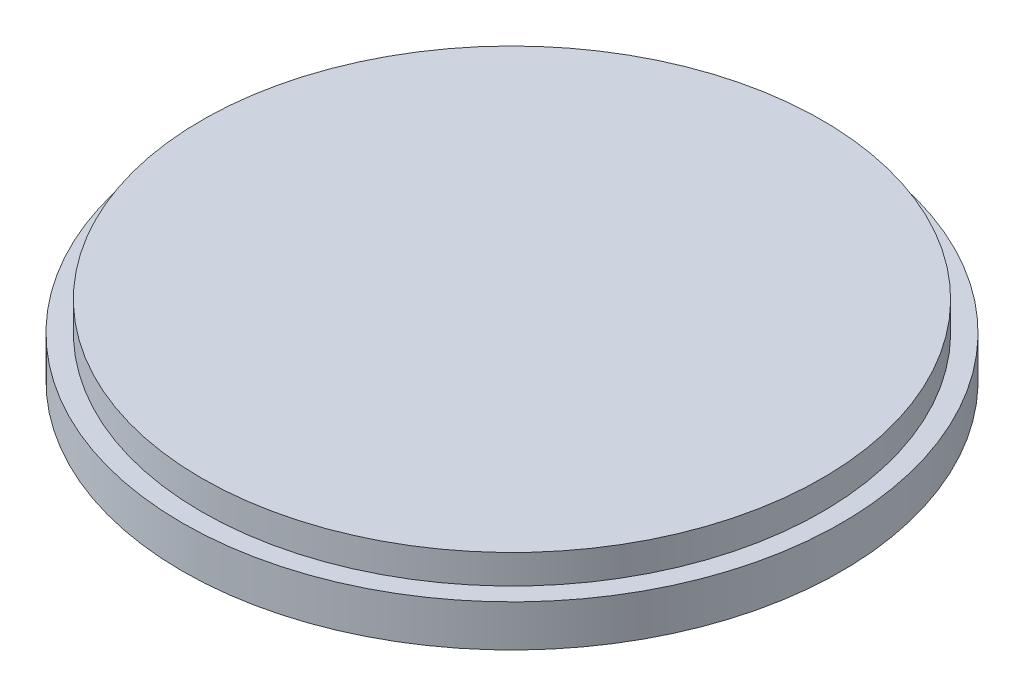
ISO-10303-21;
HEADER;
FILE_DESCRIPTION(('STEP AP214'),'2;1');
FILE_NAME('part.step','',(''),(''),'','','');
FILE_SCHEMA(('AUTOMOTIVE_DESIGN { 1 0 10303 214 1 1 1 1 }'));
ENDSEC;
DATA;
#1=APPLICATION_CONTEXT('core data for automotive mechanical design processes');
#2=APPLICATION_PROTOCOL_DEFINITION('international standard','automotive_design',2000,#1);
#3=PRODUCT_CONTEXT('',#1,'mechanical');
#4=PRODUCT('Part','Part','',(#3));
#5=PRODUCT_RELATED_PRODUCT_CATEGORY('part','',(#4));
#6=PRODUCT_DEFINITION_FORMATION('','',#4);
#7=PRODUCT_DEFINITION_CONTEXT('part definition',#1,'design');
#8=PRODUCT_DEFINITION('design','',#6,#7);
#9=PRODUCT_DEFINITION_SHAPE('','',#8);
#10=(LENGTH_UNIT() NAMED_UNIT(*) SI_UNIT(.MILLI.,.METRE.));
#11=(NAMED_UNIT(*) PLANE_ANGLE_UNIT() SI_UNIT($,.RADIAN.));
#12=(NAMED_UNIT(*) SI_UNIT($,.STERADIAN.) SOLID_ANGLE_UNIT());
#13=UNCERTAINTY_MEASURE_WITH_UNIT(LENGTH_MEASURE(1.E-05),#10,'distance_accuracy_value','');
#14=(GEOMETRIC_REPRESENTATION_CONTEXT(3) GLOBAL_UNCERTAINTY_ASSIGNED_CONTEXT((#13)) GLOBAL_UNIT_ASSIGNED_CONTEXT((#10,
#11,#12)) REPRESENTATION_CONTEXT('',''));
#15=CARTESIAN_POINT('',(0.,0.,0.));
#16=DIRECTION('',(0.,0.,1.));
#17=DIRECTION('',(1.,0.,0.));
#18=AXIS2_PLACEMENT_3D('',#15,#16,#17);
#19=CARTESIAN_POINT('',(0.,-7.3,0.));
#20=DIRECTION('',(0.,-1.,0.));
#21=DIRECTION('',(0.,0.,-1.));
#22=AXIS2_PLACEMENT_3D('',#19,#20,#21);
#23=CYLINDRICAL_SURFACE('',#22,34.);
#24=CARTESIAN_POINT('',(0.,-4.3,0.));
#25=DIRECTION('',(0.,-1.,0.));
#26=DIRECTION('',(0.,0.,-1.));
#27=AXIS2_PLACEMENT_3D('',#24,#25,#26);
#28=CIRCLE('',#27,34.);
#29=CARTESIAN_POINT('',(0.,-4.3,-34.));
#30=VERTEX_POINT('',#29);
#31=EDGE_CURVE('E88',#30,#30,#28,.T.);
#32=ORIENTED_EDGE('',*,*,#31,.F.);
#33=EDGE_LOOP('',(#32));
#34=FACE_BOUND('',#33,.T.);
#35=CARTESIAN_POINT('',(0.,0.,0.));
#36=DIRECTION('',(0.,-1.,0.));
#37=DIRECTION('',(0.,0.,-1.));
#38=AXIS2_PLACEMENT_3D('',#35,#36,#37);
#39=CIRCLE('',#38,34.);
#40=CARTESIAN_POINT('',(0.,0.,-34.));
#41=VERTEX_POINT('',#40);
#42=EDGE_CURVE('E35',#41,#41,#39,.T.);
#43=ORIENTED_EDGE('',*,*,#42,.T.);
#44=EDGE_LOOP('',(#43));
#45=FACE_BOUND('',#44,.T.);
#46=ADVANCED_FACE('F32',(#34,#45),#23,.T.);
#47=CARTESIAN_POINT('',(-34.,0.,0.));
#48=DIRECTION('',(0.,-1.,0.));
#49=DIRECTION('',(0.,0.,-1.));
#50=AXIS2_PLACEMENT_3D('',#47,#48,#49);
#51=PLANE('',#50);
#52=CARTESIAN_POINT('',(0.,0.,0.));
#53=DIRECTION('',(0.,1.,0.));
#54=DIRECTION('',(0.,0.,1.));
#55=AXIS2_PLACEMENT_3D('',#52,#53,#54);
#56=CIRCLE('',#55,32.);
#57=CARTESIAN_POINT('',(0.,0.,32.));
#58=VERTEX_POINT('',#57);
#59=EDGE_CURVE('E11',#58,#58,#56,.T.);
#60=ORIENTED_EDGE('',*,*,#59,.F.);
#61=EDGE_LOOP('',(#60));
#62=FACE_BOUND('',#61,.T.);
#63=ORIENTED_EDGE('',*,*,#42,.F.);
#64=EDGE_LOOP('',(#63));
#65=FACE_BOUND('',#64,.T.);
#66=ADVANCED_FACE('F99',(#62,#65),#51,.F.);
#67=CARTESIAN_POINT('',(-26.5,-7.3,0.));
#68=DIRECTION('',(0.,1.,0.));
#69=DIRECTION('',(0.,0.,1.));
#70=AXIS2_PLACEMENT_3D('',#67,#68,#69);
#71=PLANE('',#70);
#72=CARTESIAN_POINT('',(-15.5563491861041,-7.3,15.556349186104));
#73=DIRECTION('',(0.,-1.,0.));
#74=DIRECTION('',(0.,0.,-1.));
#75=AXIS2_PLACEMENT_3D('',#72,#73,#74);
#76=CIRCLE('',#75,1.69999999999999);
#77=CARTESIAN_POINT('',(-15.5563491861041,-7.3,13.856349186104));
#78=VERTEX_POINT('',#77);
#79=EDGE_CURVE('E64',#78,#78,#76,.T.);
#80=ORIENTED_EDGE('',*,*,#79,.F.);
#81=EDGE_LOOP('',(#80));
#82=FACE_BOUND('',#81,.T.);
#83=CARTESIAN_POINT('',(-15.556349186104,-7.3,-15.5563491861041));
#84=DIRECTION('',(0.,-1.,0.));
#85=DIRECTION('',(0.,0.,-1.));
#86=AXIS2_PLACEMENT_3D('',#83,#84,#85);
#87=CIRCLE('',#86,1.69999999999999);
#88=CARTESIAN_POINT('',(-15.556349186104,-7.3,-17.2563491861041));
#89=VERTEX_POINT('',#88);
#90=EDGE_CURVE('E63',#89,#89,#87,.T.);
#91=ORIENTED_EDGE('',*,*,#90,.F.);
#92=EDGE_LOOP('',(#91));
#93=FACE_BOUND('',#92,.T.);
#94=CARTESIAN_POINT('',(15.556349186104,-7.3,-15.556349186104));
#95=DIRECTION('',(0.,-1.,0.));
#96=DIRECTION('',(0.,0.,-1.));
#97=AXIS2_PLACEMENT_3D('',#94,#95,#96);
#98=CIRCLE('',#97,1.69999999999999);
#99=CARTESIAN_POINT('',(15.556349186104,-7.3,-17.256349186104));
#100=VERTEX_POINT('',#99);
#101=EDGE_CURVE('E74',#100,#100,#98,.T.);
#102=ORIENTED_EDGE('',*,*,#101,.F.);
#103=EDGE_LOOP('',(#102));
#104=FACE_BOUND('',#103,.T.);
#105=CARTESIAN_POINT('',(15.556349186104,-7.3,15.5563491861041));
#106=DIRECTION('',(0.,-1.,0.));
#107=DIRECTION('',(0.,0.,-1.));
#108=AXIS2_PLACEMENT_3D('',#105,#106,#107);
#109=CIRCLE('',#108,1.69999999999999);
#110=CARTESIAN_POINT('',(15.556349186104,-7.3,13.8563491861041));
#111=VERTEX_POINT('',#110);
#112=EDGE_CURVE('E80',#111,#111,#109,.T.);
#113=ORIENTED_EDGE('',*,*,#112,.F.);
#114=EDGE_LOOP('',(#113));
#115=FACE_BOUND('',#114,.T.);
#116=CARTESIAN_POINT('',(0.,-7.3,0.));
#117=DIRECTION('',(0.,-1.,0.));
#118=DIRECTION('',(0.,0.,-1.));
#119=AXIS2_PLACEMENT_3D('',#116,#117,#118);
#120=CIRCLE('',#119,26.5);
#121=CARTESIAN_POINT('',(0.,-7.3,-26.5));
#122=VERTEX_POINT('',#121);
#123=EDGE_CURVE('E91',#122,#122,#120,.T.);
#124=ORIENTED_EDGE('',*,*,#123,.T.);
#125=EDGE_LOOP('',(#124));
#126=FACE_BOUND('',#125,.T.);
#127=ADVANCED_FACE('F101',(#82,#93,#104,#115,#126),#71,.F.);
#128=CARTESIAN_POINT('',(0.,-4.3,0.));
#129=DIRECTION('',(0.,1.,0.));
#130=DIRECTION('',(0.,0.,1.));
#131=AXIS2_PLACEMENT_3D('',#128,#129,#130);
#132=CONICAL_SURFACE('',#131,34.,1.19028994968253);
#133=ORIENTED_EDGE('',*,*,#123,.F.);
#134=EDGE_LOOP('',(#133));
#135=FACE_BOUND('',#134,.T.);
#136=ORIENTED_EDGE('',*,*,#31,.T.);
#137=EDGE_LOOP('',(#136));
#138=FACE_BOUND('',#137,.T.);
#139=ADVANCED_FACE('F107',(#135,#138),#132,.T.);
#140=CARTESIAN_POINT('',(0.,3.,0.));
#141=DIRECTION('',(0.,-1.,0.));
#142=DIRECTION('',(0.,0.,-1.));
#143=AXIS2_PLACEMENT_3D('',#140,#141,#142);
#144=CYLINDRICAL_SURFACE('',#143,32.);
#145=CARTESIAN_POINT('',(0.,3.,0.));
#146=DIRECTION('',(0.,1.,0.));
#147=DIRECTION('',(0.,0.,1.));
#148=AXIS2_PLACEMENT_3D('',#145,#146,#147);
#149=CIRCLE('',#148,32.);
#150=CARTESIAN_POINT('',(0.,3.,32.));
#151=VERTEX_POINT('',#150);
#152=EDGE_CURVE('E86',#151,#151,#149,.T.);
#153=ORIENTED_EDGE('',*,*,#152,.F.);
#154=EDGE_LOOP('',(#153));
#155=FACE_BOUND('',#154,.T.);
#156=ORIENTED_EDGE('',*,*,#59,.T.);
#157=EDGE_LOOP('',(#156));
#158=FACE_BOUND('',#157,.T.);
#159=ADVANCED_FACE('F115',(#155,#158),#144,.T.);
#160=CARTESIAN_POINT('',(0.,3.,0.));
#161=DIRECTION('',(0.,1.,0.));
#162=DIRECTION('',(0.,0.,1.));
#163=AXIS2_PLACEMENT_3D('',#160,#161,#162);
#164=PLANE('',#163);
#165=ORIENTED_EDGE('',*,*,#152,.T.);
#166=EDGE_LOOP('',(#165));
#167=FACE_BOUND('',#166,.T.);
#168=ADVANCED_FACE('F119',(#167),#164,.T.);
#169=CARTESIAN_POINT('',(15.556349186104,-3.3,15.5563491861041));
#170=DIRECTION('',(0.,-1.,0.));
#171=DIRECTION('',(0.,0.,-1.));
#172=AXIS2_PLACEMENT_3D('',#169,#170,#171);
#173=CONICAL_SURFACE('',#172,1.69999999999999,1.02974425867665);
#174=CARTESIAN_POINT('',(15.556349186104,-2.27853694765315,15.5563491861041));
#175=VERTEX_POINT('',#174);
#176=VERTEX_LOOP('',#175);
#177=FACE_BOUND('',#176,.T.);
#178=CARTESIAN_POINT('',(15.556349186104,-3.3,15.5563491861041));
#179=DIRECTION('',(0.,-1.,0.));
#180=DIRECTION('',(0.,0.,-1.));
#181=AXIS2_PLACEMENT_3D('',#178,#179,#180);
#182=CIRCLE('',#181,1.69999999999999);
#183=CARTESIAN_POINT('',(15.556349186104,-3.3,13.8563491861041));
#184=VERTEX_POINT('',#183);
#185=EDGE_CURVE('E83',#184,#184,#182,.T.);
#186=ORIENTED_EDGE('',*,*,#185,.T.);
#187=EDGE_LOOP('',(#186));
#188=FACE_BOUND('',#187,.T.);
#189=ADVANCED_FACE('F123',(#177,#188),#173,.F.);
#190=CARTESIAN_POINT('',(15.556349186104,-7.3,15.5563491861041));
#191=DIRECTION('',(0.,-1.,0.));
#192=DIRECTION('',(0.,0.,-1.));
#193=AXIS2_PLACEMENT_3D('',#190,#191,#192);
#194=CYLINDRICAL_SURFACE('',#193,1.69999999999999);
#195=ORIENTED_EDGE('',*,*,#185,.F.);
#196=EDGE_LOOP('',(#195));
#197=FACE_BOUND('',#196,.T.);
#198=ORIENTED_EDGE('',*,*,#112,.T.);
#199=EDGE_LOOP('',(#198));
#200=FACE_BOUND('',#199,.T.);
#201=ADVANCED_FACE('F127',(#197,#200),#194,.F.);
#202=CARTESIAN_POINT('',(15.556349186104,-3.3,-15.556349186104));
#203=DIRECTION('',(0.,-1.,0.));
#204=DIRECTION('',(0.,0.,-1.));
#205=AXIS2_PLACEMENT_3D('',#202,#203,#204);
#206=CONICAL_SURFACE('',#205,1.69999999999999,1.02974425867665);
#207=CARTESIAN_POINT('',(15.556349186104,-2.27853694765315,-15.556349186104));
#208=VERTEX_POINT('',#207);
#209=VERTEX_LOOP('',#208);
#210=FACE_BOUND('',#209,.T.);
#211=CARTESIAN_POINT('',(15.556349186104,-3.3,-15.556349186104));
#212=DIRECTION('',(0.,-1.,0.));
#213=DIRECTION('',(0.,0.,-1.));
#214=AXIS2_PLACEMENT_3D('',#211,#212,#213);
#215=CIRCLE('',#214,1.69999999999999);
#216=CARTESIAN_POINT('',(15.556349186104,-3.3,-17.256349186104));
#217=VERTEX_POINT('',#216);
#218=EDGE_CURVE('E77',#217,#217,#215,.T.);
#219=ORIENTED_EDGE('',*,*,#218,.T.);
#220=EDGE_LOOP('',(#219));
#221=FACE_BOUND('',#220,.T.);
#222=ADVANCED_FACE('F130',(#210,#221),#206,.F.);
#223=CARTESIAN_POINT('',(15.556349186104,-7.3,-15.556349186104));
#224=DIRECTION('',(0.,-1.,0.));
#225=DIRECTION('',(0.,0.,-1.));
#226=AXIS2_PLACEMENT_3D('',#223,#224,#225);
#227=CYLINDRICAL_SURFACE('',#226,1.69999999999999);
#228=ORIENTED_EDGE('',*,*,#218,.F.);
#229=EDGE_LOOP('',(#228));
#230=FACE_BOUND('',#229,.T.);
#231=ORIENTED_EDGE('',*,*,#101,.T.);
#232=EDGE_LOOP('',(#231));
#233=FACE_BOUND('',#232,.T.);
#234=ADVANCED_FACE('F134',(#230,#233),#227,.F.);
#235=CARTESIAN_POINT('',(-15.556349186104,-3.3,-15.5563491861041));
#236=DIRECTION('',(0.,-1.,0.));
#237=DIRECTION('',(0.,0.,-1.));
#238=AXIS2_PLACEMENT_3D('',#235,#236,#237);
#239=CONICAL_SURFACE('',#238,1.69999999999999,1.02974425867665);
#240=CARTESIAN_POINT('',(-15.556349186104,-2.27853694765315,-15.5563491861041));
#241=VERTEX_POINT('',#240);
#242=VERTEX_LOOP('',#241);
#243=FACE_BOUND('',#242,.T.);
#244=CARTESIAN_POINT('',(-15.556349186104,-3.3,-15.5563491861041));
#245=DIRECTION('',(0.,-1.,0.));
#246=DIRECTION('',(0.,0.,-1.));
#247=AXIS2_PLACEMENT_3D('',#244,#245,#246);
#248=CIRCLE('',#247,1.69999999999999);
#249=CARTESIAN_POINT('',(-15.556349186104,-3.3,-17.2563491861041));
#250=VERTEX_POINT('',#249);
#251=EDGE_CURVE('E67',#250,#250,#248,.T.);
#252=ORIENTED_EDGE('',*,*,#251,.T.);
#253=EDGE_LOOP('',(#252));
#254=FACE_BOUND('',#253,.T.);
#255=ADVANCED_FACE('F137',(#243,#254),#239,.F.);
#256=CARTESIAN_POINT('',(-15.556349186104,-7.3,-15.5563491861041));
#257=DIRECTION('',(0.,-1.,0.));
#258=DIRECTION('',(0.,0.,-1.));
#259=AXIS2_PLACEMENT_3D('',#256,#257,#258);
#260=CYLINDRICAL_SURFACE('',#259,1.69999999999999);
#261=ORIENTED_EDGE('',*,*,#251,.F.);
#262=EDGE_LOOP('',(#261));
#263=FACE_BOUND('',#262,.T.);
#264=ORIENTED_EDGE('',*,*,#90,.T.);
#265=EDGE_LOOP('',(#264));
#266=FACE_BOUND('',#265,.T.);
#267=ADVANCED_FACE('F57',(#263,#266),#260,.F.);
#268=CARTESIAN_POINT('',(-15.5563491861041,-3.3,15.556349186104));
#269=DIRECTION('',(0.,-1.,0.));
#270=DIRECTION('',(0.,0.,-1.));
#271=AXIS2_PLACEMENT_3D('',#268,#269,#270);
#272=CONICAL_SURFACE('',#271,1.69999999999999,1.02974425867665);
#273=CARTESIAN_POINT('',(-15.5563491861041,-2.27853694765315,15.556349186104));
#274=VERTEX_POINT('',#273);
#275=VERTEX_LOOP('',#274);
#276=FACE_BOUND('',#275,.T.);
#277=CARTESIAN_POINT('',(-15.5563491861041,-3.3,15.556349186104));
#278=DIRECTION('',(0.,-1.,0.));
#279=DIRECTION('',(0.,0.,-1.));
#280=AXIS2_PLACEMENT_3D('',#277,#278,#279);
#281=CIRCLE('',#280,1.69999999999999);
#282=CARTESIAN_POINT('',(-15.5563491861041,-3.3,13.856349186104));
#283=VERTEX_POINT('',#282);
#284=EDGE_CURVE('E61',#283,#283,#281,.T.);
#285=ORIENTED_EDGE('',*,*,#284,.T.);
#286=EDGE_LOOP('',(#285));
#287=FACE_BOUND('',#286,.T.);
#288=ADVANCED_FACE('F53',(#276,#287),#272,.F.);
#289=CARTESIAN_POINT('',(-15.5563491861041,-7.3,15.556349186104));
#290=DIRECTION('',(0.,-1.,0.));
#291=DIRECTION('',(0.,0.,-1.));
#292=AXIS2_PLACEMENT_3D('',#289,#290,#291);
#293=CYLINDRICAL_SURFACE('',#292,1.69999999999999);
#294=ORIENTED_EDGE('',*,*,#284,.F.);
#295=EDGE_LOOP('',(#294));
#296=FACE_BOUND('',#295,.T.);
#297=ORIENTED_EDGE('',*,*,#79,.T.);
#298=EDGE_LOOP('',(#297));
#299=FACE_BOUND('',#298,.T.);
#300=ADVANCED_FACE('F56',(#296,#299),#293,.F.);
#301=CLOSED_SHELL('',(#46,#66,#127,#139,#159,#168,#189,#201,#222,#234,#255,#267,#288,#300));
#302=MANIFOLD_SOLID_BREP('B2',#301);
#303=ADVANCED_BREP_SHAPE_REPRESENTATION('',(#18,#302),#14);
#304=SHAPE_DEFINITION_REPRESENTATION(#9,#303);
ENDSEC;
END-ISO-10303-21;
